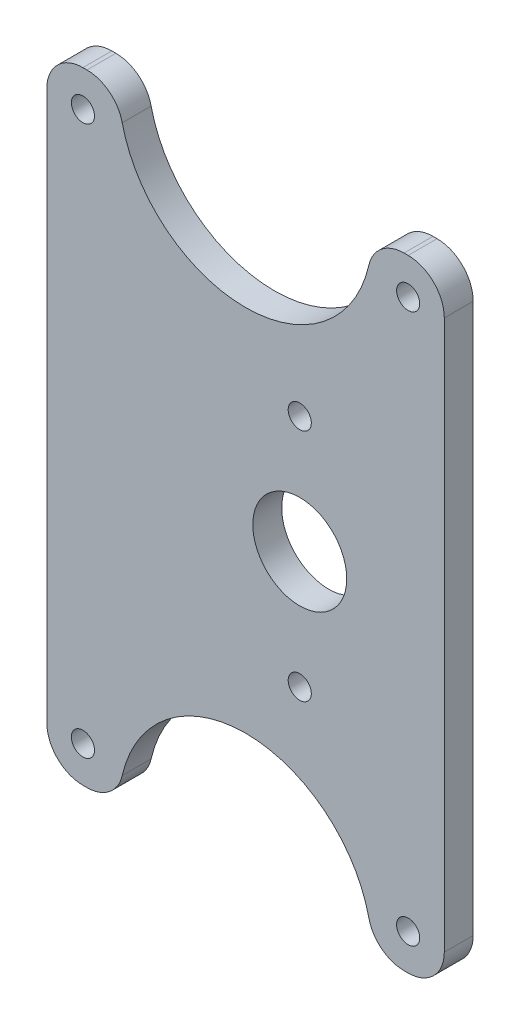
ISO-10303-21;
HEADER;
FILE_DESCRIPTION(('STEP AP214'),'2;1');
FILE_NAME('part.step','',(''),(''),'','','');
FILE_SCHEMA(('AUTOMOTIVE_DESIGN { 1 0 10303 214 1 1 1 1 }'));
ENDSEC;
DATA;
#1=APPLICATION_CONTEXT('core data for automotive mechanical design processes');
#2=APPLICATION_PROTOCOL_DEFINITION('international standard','automotive_design',2000,#1);
#3=PRODUCT_CONTEXT('',#1,'mechanical');
#4=PRODUCT('Part','Part','',(#3));
#5=PRODUCT_RELATED_PRODUCT_CATEGORY('part','',(#4));
#6=PRODUCT_DEFINITION_FORMATION('','',#4);
#7=PRODUCT_DEFINITION_CONTEXT('part definition',#1,'design');
#8=PRODUCT_DEFINITION('design','',#6,#7);
#9=PRODUCT_DEFINITION_SHAPE('','',#8);
#10=(LENGTH_UNIT() NAMED_UNIT(*) SI_UNIT(.MILLI.,.METRE.));
#11=(NAMED_UNIT(*) PLANE_ANGLE_UNIT() SI_UNIT($,.RADIAN.));
#12=(NAMED_UNIT(*) SI_UNIT($,.STERADIAN.) SOLID_ANGLE_UNIT());
#13=UNCERTAINTY_MEASURE_WITH_UNIT(LENGTH_MEASURE(1.E-05),#10,'distance_accuracy_value','');
#14=(GEOMETRIC_REPRESENTATION_CONTEXT(3) GLOBAL_UNCERTAINTY_ASSIGNED_CONTEXT((#13)) GLOBAL_UNIT_ASSIGNED_CONTEXT((#10,
#11,#12)) REPRESENTATION_CONTEXT('',''));
#15=CARTESIAN_POINT('',(0.,0.,0.));
#16=DIRECTION('',(0.,0.,1.));
#17=DIRECTION('',(1.,0.,0.));
#18=AXIS2_PLACEMENT_3D('',#15,#16,#17);
#19=CARTESIAN_POINT('',(-27.5,43.,2.));
#20=DIRECTION('',(0.,-1.,0.));
#21=DIRECTION('',(0.,0.,-1.));
#22=AXIS2_PLACEMENT_3D('',#19,#20,#21);
#23=PLANE('',#22);
#24=DIRECTION('',(-1.,0.,0.));
#25=VECTOR('',#24,1.);
#26=CARTESIAN_POINT('',(-27.5,43.,2.));
#27=LINE('',#26,#25);
#28=CARTESIAN_POINT('',(22.5,43.,2.));
#29=VERTEX_POINT('',#28);
#30=CARTESIAN_POINT('',(21.9374109684803,43.,2.));
#31=VERTEX_POINT('',#30);
#32=EDGE_CURVE('E302',#29,#31,#27,.T.);
#33=ORIENTED_EDGE('',*,*,#32,.F.);
#34=DIRECTION('',(0.,0.,-1.));
#35=VECTOR('',#34,1.);
#36=CARTESIAN_POINT('',(22.5,43.,2.));
#37=LINE('',#36,#35);
#38=CARTESIAN_POINT('',(22.5,43.,-2.));
#39=VERTEX_POINT('',#38);
#40=EDGE_CURVE('E282',#29,#39,#37,.T.);
#41=ORIENTED_EDGE('',*,*,#40,.T.);
#42=DIRECTION('',(-1.,0.,0.));
#43=VECTOR('',#42,1.);
#44=CARTESIAN_POINT('',(-27.5,43.,-2.));
#45=LINE('',#44,#43);
#46=CARTESIAN_POINT('',(21.9374109684803,43.,-2.));
#47=VERTEX_POINT('',#46);
#48=EDGE_CURVE('E185',#39,#47,#45,.T.);
#49=ORIENTED_EDGE('',*,*,#48,.T.);
#50=DIRECTION('',(0.,0.,1.));
#51=VECTOR('',#50,1.);
#52=CARTESIAN_POINT('',(21.9374109684803,43.,2.));
#53=LINE('',#52,#51);
#54=EDGE_CURVE('E279',#47,#31,#53,.T.);
#55=ORIENTED_EDGE('',*,*,#54,.T.);
#56=EDGE_LOOP('',(#33,#41,#49,#55));
#57=FACE_BOUND('',#56,.T.);
#58=ADVANCED_FACE('F39',(#57),#23,.F.);
#59=CARTESIAN_POINT('',(-27.5,-43.,2.));
#60=DIRECTION('',(0.,1.,0.));
#61=DIRECTION('',(0.,0.,1.));
#62=AXIS2_PLACEMENT_3D('',#59,#60,#61);
#63=PLANE('',#62);
#64=DIRECTION('',(1.,0.,0.));
#65=VECTOR('',#64,1.);
#66=CARTESIAN_POINT('',(-27.5,-43.,2.));
#67=LINE('',#66,#65);
#68=CARTESIAN_POINT('',(-22.5,-43.,2.));
#69=VERTEX_POINT('',#68);
#70=CARTESIAN_POINT('',(-21.9374109684803,-43.,2.));
#71=VERTEX_POINT('',#70);
#72=EDGE_CURVE('E205',#69,#71,#67,.T.);
#73=ORIENTED_EDGE('',*,*,#72,.F.);
#74=DIRECTION('',(0.,0.,-1.));
#75=VECTOR('',#74,1.);
#76=CARTESIAN_POINT('',(-22.5,-43.,2.));
#77=LINE('',#76,#75);
#78=CARTESIAN_POINT('',(-22.5,-43.,-2.));
#79=VERTEX_POINT('',#78);
#80=EDGE_CURVE('E261',#69,#79,#77,.T.);
#81=ORIENTED_EDGE('',*,*,#80,.T.);
#82=DIRECTION('',(1.,0.,0.));
#83=VECTOR('',#82,1.);
#84=CARTESIAN_POINT('',(-27.5,-43.,-2.));
#85=LINE('',#84,#83);
#86=CARTESIAN_POINT('',(-21.9374109684803,-43.,-2.));
#87=VERTEX_POINT('',#86);
#88=EDGE_CURVE('E190',#79,#87,#85,.T.);
#89=ORIENTED_EDGE('',*,*,#88,.T.);
#90=DIRECTION('',(0.,0.,1.));
#91=VECTOR('',#90,1.);
#92=CARTESIAN_POINT('',(-21.9374109684803,-43.,2.));
#93=LINE('',#92,#91);
#94=EDGE_CURVE('E257',#87,#71,#93,.T.);
#95=ORIENTED_EDGE('',*,*,#94,.T.);
#96=EDGE_LOOP('',(#73,#81,#89,#95));
#97=FACE_BOUND('',#96,.T.);
#98=ADVANCED_FACE('F402',(#97),#63,.F.);
#99=CARTESIAN_POINT('',(27.5,43.,2.));
#100=DIRECTION('',(-1.,0.,0.));
#101=DIRECTION('',(0.,-1.,0.));
#102=AXIS2_PLACEMENT_3D('',#99,#100,#101);
#103=PLANE('',#102);
#104=DIRECTION('',(0.,1.,0.));
#105=VECTOR('',#104,1.);
#106=CARTESIAN_POINT('',(27.5,43.,2.));
#107=LINE('',#106,#105);
#108=CARTESIAN_POINT('',(27.5,-38.,2.));
#109=VERTEX_POINT('',#108);
#110=CARTESIAN_POINT('',(27.5,38.,2.));
#111=VERTEX_POINT('',#110);
#112=EDGE_CURVE('E199',#109,#111,#107,.T.);
#113=ORIENTED_EDGE('',*,*,#112,.F.);
#114=DIRECTION('',(0.,0.,-1.));
#115=VECTOR('',#114,1.);
#116=CARTESIAN_POINT('',(27.5,-38.,2.));
#117=LINE('',#116,#115);
#118=CARTESIAN_POINT('',(27.5,-38.,-2.));
#119=VERTEX_POINT('',#118);
#120=EDGE_CURVE('E268',#109,#119,#117,.T.);
#121=ORIENTED_EDGE('',*,*,#120,.T.);
#122=DIRECTION('',(0.,1.,0.));
#123=VECTOR('',#122,1.);
#124=CARTESIAN_POINT('',(27.5,43.,-2.));
#125=LINE('',#124,#123);
#126=CARTESIAN_POINT('',(27.5,38.,-2.));
#127=VERTEX_POINT('',#126);
#128=EDGE_CURVE('E319',#119,#127,#125,.T.);
#129=ORIENTED_EDGE('',*,*,#128,.T.);
#130=DIRECTION('',(0.,0.,-1.));
#131=VECTOR('',#130,1.);
#132=CARTESIAN_POINT('',(27.5,38.,2.));
#133=LINE('',#132,#131);
#134=EDGE_CURVE('E265',#127,#111,#133,.F.);
#135=ORIENTED_EDGE('',*,*,#134,.T.);
#136=EDGE_LOOP('',(#113,#121,#129,#135));
#137=FACE_BOUND('',#136,.T.);
#138=ADVANCED_FACE('F428',(#137),#103,.F.);
#139=CARTESIAN_POINT('',(-21.9374109684803,43.,-2.));
#140=VERTEX_POINT('',#139);
#141=CARTESIAN_POINT('',(-22.5,43.,-2.));
#142=VERTEX_POINT('',#141);
#143=EDGE_CURVE('E193',#140,#142,#45,.T.);
#144=ORIENTED_EDGE('',*,*,#143,.T.);
#145=DIRECTION('',(0.,0.,-1.));
#146=VECTOR('',#145,1.);
#147=CARTESIAN_POINT('',(-22.5,43.,2.));
#148=LINE('',#147,#146);
#149=CARTESIAN_POINT('',(-22.5,43.,2.));
#150=VERTEX_POINT('',#149);
#151=EDGE_CURVE('E160',#142,#150,#148,.F.);
#152=ORIENTED_EDGE('',*,*,#151,.T.);
#153=CARTESIAN_POINT('',(-21.9374109684803,43.,2.));
#154=VERTEX_POINT('',#153);
#155=EDGE_CURVE('E308',#154,#150,#27,.T.);
#156=ORIENTED_EDGE('',*,*,#155,.F.);
#157=DIRECTION('',(0.,0.,1.));
#158=VECTOR('',#157,1.);
#159=CARTESIAN_POINT('',(-21.9374109684803,43.,2.));
#160=LINE('',#159,#158);
#161=EDGE_CURVE('E166',#154,#140,#160,.F.);
#162=ORIENTED_EDGE('',*,*,#161,.T.);
#163=EDGE_LOOP('',(#144,#152,#156,#162));
#164=FACE_BOUND('',#163,.T.);
#165=ADVANCED_FACE('F412',(#164),#23,.F.);
#166=CARTESIAN_POINT('',(-27.5,43.,2.));
#167=DIRECTION('',(1.,0.,0.));
#168=DIRECTION('',(0.,1.,0.));
#169=AXIS2_PLACEMENT_3D('',#166,#167,#168);
#170=PLANE('',#169);
#171=DIRECTION('',(0.,-1.,0.));
#172=VECTOR('',#171,1.);
#173=CARTESIAN_POINT('',(-27.5,43.,2.));
#174=LINE('',#173,#172);
#175=CARTESIAN_POINT('',(-27.5,38.,2.));
#176=VERTEX_POINT('',#175);
#177=CARTESIAN_POINT('',(-27.5,-38.,2.));
#178=VERTEX_POINT('',#177);
#179=EDGE_CURVE('E176',#176,#178,#174,.T.);
#180=ORIENTED_EDGE('',*,*,#179,.F.);
#181=DIRECTION('',(0.,0.,-1.));
#182=VECTOR('',#181,1.);
#183=CARTESIAN_POINT('',(-27.5,38.,2.));
#184=LINE('',#183,#182);
#185=CARTESIAN_POINT('',(-27.5,38.,-2.));
#186=VERTEX_POINT('',#185);
#187=EDGE_CURVE('E159',#176,#186,#184,.T.);
#188=ORIENTED_EDGE('',*,*,#187,.T.);
#189=DIRECTION('',(0.,-1.,0.));
#190=VECTOR('',#189,1.);
#191=CARTESIAN_POINT('',(-27.5,43.,-2.));
#192=LINE('',#191,#190);
#193=CARTESIAN_POINT('',(-27.5,-38.,-2.));
#194=VERTEX_POINT('',#193);
#195=EDGE_CURVE('E173',#186,#194,#192,.T.);
#196=ORIENTED_EDGE('',*,*,#195,.T.);
#197=DIRECTION('',(0.,0.,-1.));
#198=VECTOR('',#197,1.);
#199=CARTESIAN_POINT('',(-27.5,-38.,2.));
#200=LINE('',#199,#198);
#201=EDGE_CURVE('E179',#194,#178,#200,.F.);
#202=ORIENTED_EDGE('',*,*,#201,.T.);
#203=EDGE_LOOP('',(#180,#188,#196,#202));
#204=FACE_BOUND('',#203,.T.);
#205=ADVANCED_FACE('F172',(#204),#170,.F.);
#206=CARTESIAN_POINT('',(21.9374109684803,-43.,-2.));
#207=VERTEX_POINT('',#206);
#208=CARTESIAN_POINT('',(22.5,-43.,-2.));
#209=VERTEX_POINT('',#208);
#210=EDGE_CURVE('E184',#207,#209,#85,.T.);
#211=ORIENTED_EDGE('',*,*,#210,.T.);
#212=DIRECTION('',(0.,0.,-1.));
#213=VECTOR('',#212,1.);
#214=CARTESIAN_POINT('',(22.5,-43.,2.));
#215=LINE('',#214,#213);
#216=CARTESIAN_POINT('',(22.5,-43.,2.));
#217=VERTEX_POINT('',#216);
#218=EDGE_CURVE('E276',#209,#217,#215,.F.);
#219=ORIENTED_EDGE('',*,*,#218,.T.);
#220=CARTESIAN_POINT('',(21.9374109684803,-43.,2.));
#221=VERTEX_POINT('',#220);
#222=EDGE_CURVE('E312',#221,#217,#67,.T.);
#223=ORIENTED_EDGE('',*,*,#222,.F.);
#224=DIRECTION('',(0.,0.,1.));
#225=VECTOR('',#224,1.);
#226=CARTESIAN_POINT('',(21.9374109684803,-43.,2.));
#227=LINE('',#226,#225);
#228=EDGE_CURVE('E272',#221,#207,#227,.F.);
#229=ORIENTED_EDGE('',*,*,#228,.T.);
#230=EDGE_LOOP('',(#211,#219,#223,#229));
#231=FACE_BOUND('',#230,.T.);
#232=ADVANCED_FACE('F430',(#231),#63,.F.);
#233=CARTESIAN_POINT('',(0.,0.,2.));
#234=DIRECTION('',(0.,0.,1.));
#235=DIRECTION('',(1.,0.,0.));
#236=AXIS2_PLACEMENT_3D('',#233,#234,#235);
#237=PLANE('',#236);
#238=ORIENTED_EDGE('',*,*,#155,.T.);
#239=CARTESIAN_POINT('',(-22.5,38.,2.));
#240=DIRECTION('',(0.,0.,1.));
#241=DIRECTION('',(1.,0.,0.));
#242=AXIS2_PLACEMENT_3D('',#239,#240,#241);
#243=CIRCLE('',#242,5.);
#244=EDGE_CURVE('E254',#150,#176,#243,.T.);
#245=ORIENTED_EDGE('',*,*,#244,.T.);
#246=ORIENTED_EDGE('',*,*,#179,.T.);
#247=CARTESIAN_POINT('',(-22.5,-38.,2.));
#248=DIRECTION('',(0.,0.,1.));
#249=DIRECTION('',(1.,0.,0.));
#250=AXIS2_PLACEMENT_3D('',#247,#248,#249);
#251=CIRCLE('',#250,5.);
#252=EDGE_CURVE('E251',#178,#69,#251,.T.);
#253=ORIENTED_EDGE('',*,*,#252,.T.);
#254=ORIENTED_EDGE('',*,*,#72,.T.);
#255=CARTESIAN_POINT('',(-21.9374109684803,-38.,2.));
#256=DIRECTION('',(0.,0.,1.));
#257=DIRECTION('',(1.,0.,0.));
#258=AXIS2_PLACEMENT_3D('',#255,#256,#257);
#259=CIRCLE('',#258,5.);
#260=CARTESIAN_POINT('',(-17.0624307532625,-39.1111111111111,2.));
#261=VERTEX_POINT('',#260);
#262=EDGE_CURVE('E243',#71,#261,#259,.T.);
#263=ORIENTED_EDGE('',*,*,#262,.T.);
#264=CARTESIAN_POINT('',(0.,-43.,2.));
#265=DIRECTION('',(0.,0.,1.));
#266=DIRECTION('',(-1.,0.,0.));
#267=AXIS2_PLACEMENT_3D('',#264,#265,#266);
#268=CIRCLE('',#267,17.5);
#269=CARTESIAN_POINT('',(17.0624307532625,-39.1111111111111,2.));
#270=VERTEX_POINT('',#269);
#271=EDGE_CURVE('E384',#270,#261,#268,.T.);
#272=ORIENTED_EDGE('',*,*,#271,.F.);
#273=CARTESIAN_POINT('',(21.9374109684803,-38.,2.));
#274=DIRECTION('',(0.,0.,1.));
#275=DIRECTION('',(1.,0.,0.));
#276=AXIS2_PLACEMENT_3D('',#273,#274,#275);
#277=CIRCLE('',#276,5.);
#278=EDGE_CURVE('E240',#270,#221,#277,.T.);
#279=ORIENTED_EDGE('',*,*,#278,.T.);
#280=ORIENTED_EDGE('',*,*,#222,.T.);
#281=CARTESIAN_POINT('',(22.5,-38.,2.));
#282=DIRECTION('',(0.,0.,1.));
#283=DIRECTION('',(1.,0.,0.));
#284=AXIS2_PLACEMENT_3D('',#281,#282,#283);
#285=CIRCLE('',#284,5.);
#286=EDGE_CURVE('E248',#217,#109,#285,.T.);
#287=ORIENTED_EDGE('',*,*,#286,.T.);
#288=ORIENTED_EDGE('',*,*,#112,.T.);
#289=CARTESIAN_POINT('',(22.5,38.,2.));
#290=DIRECTION('',(0.,0.,1.));
#291=DIRECTION('',(1.,0.,0.));
#292=AXIS2_PLACEMENT_3D('',#289,#290,#291);
#293=CIRCLE('',#292,5.);
#294=EDGE_CURVE('E63',#111,#29,#293,.T.);
#295=ORIENTED_EDGE('',*,*,#294,.T.);
#296=ORIENTED_EDGE('',*,*,#32,.T.);
#297=CARTESIAN_POINT('',(21.9374109684803,38.,2.));
#298=DIRECTION('',(0.,0.,1.));
#299=DIRECTION('',(1.,0.,0.));
#300=AXIS2_PLACEMENT_3D('',#297,#298,#299);
#301=CIRCLE('',#300,5.);
#302=CARTESIAN_POINT('',(17.0624307532625,39.1111111111111,2.));
#303=VERTEX_POINT('',#302);
#304=EDGE_CURVE('E55',#31,#303,#301,.T.);
#305=ORIENTED_EDGE('',*,*,#304,.T.);
#306=CARTESIAN_POINT('',(0.,43.,2.));
#307=DIRECTION('',(0.,0.,1.));
#308=DIRECTION('',(1.,0.,0.));
#309=AXIS2_PLACEMENT_3D('',#306,#307,#308);
#310=CIRCLE('',#309,17.5);
#311=CARTESIAN_POINT('',(-17.0624307532625,39.1111111111111,2.));
#312=VERTEX_POINT('',#311);
#313=EDGE_CURVE('E298',#312,#303,#310,.T.);
#314=ORIENTED_EDGE('',*,*,#313,.F.);
#315=CARTESIAN_POINT('',(-21.9374109684803,38.,2.));
#316=DIRECTION('',(0.,0.,1.));
#317=DIRECTION('',(1.,0.,0.));
#318=AXIS2_PLACEMENT_3D('',#315,#316,#317);
#319=CIRCLE('',#318,5.);
#320=EDGE_CURVE('E237',#312,#154,#319,.T.);
#321=ORIENTED_EDGE('',*,*,#320,.T.);
#322=EDGE_LOOP('',(#238,#245,#246,#253,#254,#263,#272,#279,#280,#287,#288,#295,#296,#305,#314,#321));
#323=FACE_BOUND('',#322,.T.);
#324=CARTESIAN_POINT('',(7.50000000000466,16.2150000000004,2.));
#325=DIRECTION('',(0.,0.,-1.));
#326=DIRECTION('',(-1.,0.,0.));
#327=AXIS2_PLACEMENT_3D('',#324,#325,#326);
#328=CIRCLE('',#327,1.59999999999998);
#329=CARTESIAN_POINT('',(5.90000000000468,16.2150000000004,2.));
#330=VERTEX_POINT('',#329);
#331=EDGE_CURVE('E350',#330,#330,#328,.T.);
#332=ORIENTED_EDGE('',*,*,#331,.T.);
#333=EDGE_LOOP('',(#332));
#334=FACE_BOUND('',#333,.T.);
#335=CARTESIAN_POINT('',(7.49999999999547,-16.2149999999996,2.));
#336=DIRECTION('',(0.,0.,-1.));
#337=DIRECTION('',(-1.,0.,0.));
#338=AXIS2_PLACEMENT_3D('',#335,#336,#337);
#339=CIRCLE('',#338,1.59999999999998);
#340=CARTESIAN_POINT('',(5.89999999999549,-16.2149999999996,2.));
#341=VERTEX_POINT('',#340);
#342=EDGE_CURVE('E373',#341,#341,#339,.T.);
#343=ORIENTED_EDGE('',*,*,#342,.T.);
#344=EDGE_LOOP('',(#343));
#345=FACE_BOUND('',#344,.T.);
#346=CARTESIAN_POINT('',(-22.5,-38.,2.));
#347=DIRECTION('',(0.,0.,1.));
#348=DIRECTION('',(-1.,0.,0.));
#349=AXIS2_PLACEMENT_3D('',#346,#347,#348);
#350=CIRCLE('',#349,1.6);
#351=CARTESIAN_POINT('',(-24.1,-38.,2.));
#352=VERTEX_POINT('',#351);
#353=EDGE_CURVE('E345',#352,#352,#350,.T.);
#354=ORIENTED_EDGE('',*,*,#353,.F.);
#355=EDGE_LOOP('',(#354));
#356=FACE_BOUND('',#355,.T.);
#357=CARTESIAN_POINT('',(22.5,-38.,2.));
#358=DIRECTION('',(0.,0.,1.));
#359=DIRECTION('',(1.,0.,0.));
#360=AXIS2_PLACEMENT_3D('',#357,#358,#359);
#361=CIRCLE('',#360,1.6);
#362=CARTESIAN_POINT('',(24.1,-38.,2.));
#363=VERTEX_POINT('',#362);
#364=EDGE_CURVE('E354',#363,#363,#361,.T.);
#365=ORIENTED_EDGE('',*,*,#364,.F.);
#366=EDGE_LOOP('',(#365));
#367=FACE_BOUND('',#366,.T.);
#368=CARTESIAN_POINT('',(22.5,38.,2.));
#369=DIRECTION('',(0.,0.,1.));
#370=DIRECTION('',(-1.,0.,0.));
#371=AXIS2_PLACEMENT_3D('',#368,#369,#370);
#372=CIRCLE('',#371,1.6);
#373=CARTESIAN_POINT('',(20.9,38.,2.));
#374=VERTEX_POINT('',#373);
#375=EDGE_CURVE('E362',#374,#374,#372,.T.);
#376=ORIENTED_EDGE('',*,*,#375,.F.);
#377=EDGE_LOOP('',(#376));
#378=FACE_BOUND('',#377,.T.);
#379=CARTESIAN_POINT('',(-22.5,38.,2.));
#380=DIRECTION('',(0.,0.,1.));
#381=DIRECTION('',(1.,0.,0.));
#382=AXIS2_PLACEMENT_3D('',#379,#380,#381);
#383=CIRCLE('',#382,1.6);
#384=CARTESIAN_POINT('',(-20.9,38.,2.));
#385=VERTEX_POINT('',#384);
#386=EDGE_CURVE('E337',#385,#385,#383,.T.);
#387=ORIENTED_EDGE('',*,*,#386,.F.);
#388=EDGE_LOOP('',(#387));
#389=FACE_BOUND('',#388,.T.);
#390=CARTESIAN_POINT('',(7.50000000000001,0.,2.));
#391=DIRECTION('',(0.,0.,1.));
#392=DIRECTION('',(1.,0.,0.));
#393=AXIS2_PLACEMENT_3D('',#390,#391,#392);
#394=CIRCLE('',#393,6.5);
#395=CARTESIAN_POINT('',(14.,0.,2.));
#396=VERTEX_POINT('',#395);
#397=EDGE_CURVE('E329',#396,#396,#394,.T.);
#398=ORIENTED_EDGE('',*,*,#397,.F.);
#399=EDGE_LOOP('',(#398));
#400=FACE_BOUND('',#399,.T.);
#401=ADVANCED_FACE('F305',(#323,#334,#345,#356,#367,#378,#389,#400),#237,.T.);
#402=CARTESIAN_POINT('',(0.,0.,-2.));
#403=DIRECTION('',(0.,0.,1.));
#404=DIRECTION('',(1.,0.,0.));
#405=AXIS2_PLACEMENT_3D('',#402,#403,#404);
#406=PLANE('',#405);
#407=CARTESIAN_POINT('',(7.50000000000466,16.2150000000004,-2.));
#408=DIRECTION('',(0.,0.,-1.));
#409=DIRECTION('',(-1.,0.,0.));
#410=AXIS2_PLACEMENT_3D('',#407,#408,#409);
#411=CIRCLE('',#410,1.59999999999998);
#412=CARTESIAN_POINT('',(5.90000000000468,16.2150000000004,-2.));
#413=VERTEX_POINT('',#412);
#414=EDGE_CURVE('E377',#413,#413,#411,.T.);
#415=ORIENTED_EDGE('',*,*,#414,.F.);
#416=EDGE_LOOP('',(#415));
#417=FACE_BOUND('',#416,.T.);
#418=CARTESIAN_POINT('',(7.49999999999547,-16.2149999999996,-2.));
#419=DIRECTION('',(0.,0.,-1.));
#420=DIRECTION('',(-1.,0.,0.));
#421=AXIS2_PLACEMENT_3D('',#418,#419,#420);
#422=CIRCLE('',#421,1.59999999999998);
#423=CARTESIAN_POINT('',(5.89999999999549,-16.2149999999996,-2.));
#424=VERTEX_POINT('',#423);
#425=EDGE_CURVE('E369',#424,#424,#422,.T.);
#426=ORIENTED_EDGE('',*,*,#425,.F.);
#427=EDGE_LOOP('',(#426));
#428=FACE_BOUND('',#427,.T.);
#429=CARTESIAN_POINT('',(-22.5,-38.,-2.));
#430=DIRECTION('',(0.,0.,1.));
#431=DIRECTION('',(-1.,0.,0.));
#432=AXIS2_PLACEMENT_3D('',#429,#430,#431);
#433=CIRCLE('',#432,1.6);
#434=CARTESIAN_POINT('',(-24.1,-38.,-2.));
#435=VERTEX_POINT('',#434);
#436=EDGE_CURVE('E349',#435,#435,#433,.T.);
#437=ORIENTED_EDGE('',*,*,#436,.T.);
#438=EDGE_LOOP('',(#437));
#439=FACE_BOUND('',#438,.T.);
#440=CARTESIAN_POINT('',(22.5,-38.,-2.));
#441=DIRECTION('',(0.,0.,1.));
#442=DIRECTION('',(1.,0.,0.));
#443=AXIS2_PLACEMENT_3D('',#440,#441,#442);
#444=CIRCLE('',#443,1.6);
#445=CARTESIAN_POINT('',(24.1,-38.,-2.));
#446=VERTEX_POINT('',#445);
#447=EDGE_CURVE('E358',#446,#446,#444,.T.);
#448=ORIENTED_EDGE('',*,*,#447,.T.);
#449=EDGE_LOOP('',(#448));
#450=FACE_BOUND('',#449,.T.);
#451=CARTESIAN_POINT('',(22.5,38.,-2.));
#452=DIRECTION('',(0.,0.,1.));
#453=DIRECTION('',(-1.,0.,0.));
#454=AXIS2_PLACEMENT_3D('',#451,#452,#453);
#455=CIRCLE('',#454,1.6);
#456=CARTESIAN_POINT('',(20.9,38.,-2.));
#457=VERTEX_POINT('',#456);
#458=EDGE_CURVE('E341',#457,#457,#455,.T.);
#459=ORIENTED_EDGE('',*,*,#458,.T.);
#460=EDGE_LOOP('',(#459));
#461=FACE_BOUND('',#460,.T.);
#462=CARTESIAN_POINT('',(-22.5,38.,-2.));
#463=DIRECTION('',(0.,0.,1.));
#464=DIRECTION('',(1.,0.,0.));
#465=AXIS2_PLACEMENT_3D('',#462,#463,#464);
#466=CIRCLE('',#465,1.6);
#467=CARTESIAN_POINT('',(-20.9,38.,-2.));
#468=VERTEX_POINT('',#467);
#469=EDGE_CURVE('E335',#468,#468,#466,.T.);
#470=ORIENTED_EDGE('',*,*,#469,.T.);
#471=EDGE_LOOP('',(#470));
#472=FACE_BOUND('',#471,.T.);
#473=CARTESIAN_POINT('',(7.50000000000001,0.,-2.));
#474=DIRECTION('',(0.,0.,1.));
#475=DIRECTION('',(1.,0.,0.));
#476=AXIS2_PLACEMENT_3D('',#473,#474,#475);
#477=CIRCLE('',#476,6.5);
#478=CARTESIAN_POINT('',(14.,0.,-2.));
#479=VERTEX_POINT('',#478);
#480=EDGE_CURVE('E322',#479,#479,#477,.T.);
#481=ORIENTED_EDGE('',*,*,#480,.T.);
#482=EDGE_LOOP('',(#481));
#483=FACE_BOUND('',#482,.T.);
#484=ORIENTED_EDGE('',*,*,#195,.F.);
#485=CARTESIAN_POINT('',(-22.5,38.,-2.));
#486=DIRECTION('',(0.,0.,1.));
#487=DIRECTION('',(1.,0.,0.));
#488=AXIS2_PLACEMENT_3D('',#485,#486,#487);
#489=CIRCLE('',#488,5.);
#490=EDGE_CURVE('E155',#186,#142,#489,.F.);
#491=ORIENTED_EDGE('',*,*,#490,.T.);
#492=ORIENTED_EDGE('',*,*,#143,.F.);
#493=CARTESIAN_POINT('',(-21.9374109684803,38.,-2.));
#494=DIRECTION('',(0.,0.,1.));
#495=DIRECTION('',(1.,0.,0.));
#496=AXIS2_PLACEMENT_3D('',#493,#494,#495);
#497=CIRCLE('',#496,5.);
#498=CARTESIAN_POINT('',(-17.0624307532625,39.1111111111111,-2.));
#499=VERTEX_POINT('',#498);
#500=EDGE_CURVE('E213',#140,#499,#497,.F.);
#501=ORIENTED_EDGE('',*,*,#500,.T.);
#502=CARTESIAN_POINT('',(0.,43.,-2.));
#503=DIRECTION('',(0.,0.,1.));
#504=DIRECTION('',(1.,0.,0.));
#505=AXIS2_PLACEMENT_3D('',#502,#503,#504);
#506=CIRCLE('',#505,17.5);
#507=CARTESIAN_POINT('',(17.0624307532625,39.1111111111111,-2.));
#508=VERTEX_POINT('',#507);
#509=EDGE_CURVE('E204',#499,#508,#506,.T.);
#510=ORIENTED_EDGE('',*,*,#509,.T.);
#511=CARTESIAN_POINT('',(21.9374109684803,38.,-2.));
#512=DIRECTION('',(0.,0.,1.));
#513=DIRECTION('',(1.,0.,0.));
#514=AXIS2_PLACEMENT_3D('',#511,#512,#513);
#515=CIRCLE('',#514,5.);
#516=EDGE_CURVE('E178',#508,#47,#515,.F.);
#517=ORIENTED_EDGE('',*,*,#516,.T.);
#518=ORIENTED_EDGE('',*,*,#48,.F.);
#519=CARTESIAN_POINT('',(22.5,38.,-2.));
#520=DIRECTION('',(0.,0.,1.));
#521=DIRECTION('',(1.,0.,0.));
#522=AXIS2_PLACEMENT_3D('',#519,#520,#521);
#523=CIRCLE('',#522,5.);
#524=EDGE_CURVE('E222',#39,#127,#523,.F.);
#525=ORIENTED_EDGE('',*,*,#524,.T.);
#526=ORIENTED_EDGE('',*,*,#128,.F.);
#527=CARTESIAN_POINT('',(22.5,-38.,-2.));
#528=DIRECTION('',(0.,0.,1.));
#529=DIRECTION('',(1.,0.,0.));
#530=AXIS2_PLACEMENT_3D('',#527,#528,#529);
#531=CIRCLE('',#530,5.);
#532=EDGE_CURVE('E225',#119,#209,#531,.F.);
#533=ORIENTED_EDGE('',*,*,#532,.T.);
#534=ORIENTED_EDGE('',*,*,#210,.F.);
#535=CARTESIAN_POINT('',(21.9374109684803,-38.,-2.));
#536=DIRECTION('',(0.,0.,1.));
#537=DIRECTION('',(1.,0.,0.));
#538=AXIS2_PLACEMENT_3D('',#535,#536,#537);
#539=CIRCLE('',#538,5.);
#540=CARTESIAN_POINT('',(17.0624307532625,-39.1111111111111,-2.));
#541=VERTEX_POINT('',#540);
#542=EDGE_CURVE('E216',#207,#541,#539,.F.);
#543=ORIENTED_EDGE('',*,*,#542,.T.);
#544=CARTESIAN_POINT('',(0.,-43.,-2.));
#545=DIRECTION('',(0.,0.,1.));
#546=DIRECTION('',(1.,0.,0.));
#547=AXIS2_PLACEMENT_3D('',#544,#545,#546);
#548=CIRCLE('',#547,17.5);
#549=CARTESIAN_POINT('',(-17.0624307532625,-39.1111111111111,-2.));
#550=VERTEX_POINT('',#549);
#551=EDGE_CURVE('E200',#541,#550,#548,.T.);
#552=ORIENTED_EDGE('',*,*,#551,.T.);
#553=CARTESIAN_POINT('',(-21.9374109684803,-38.,-2.));
#554=DIRECTION('',(0.,0.,1.));
#555=DIRECTION('',(1.,0.,0.));
#556=AXIS2_PLACEMENT_3D('',#553,#554,#555);
#557=CIRCLE('',#556,5.);
#558=EDGE_CURVE('E219',#550,#87,#557,.F.);
#559=ORIENTED_EDGE('',*,*,#558,.T.);
#560=ORIENTED_EDGE('',*,*,#88,.F.);
#561=CARTESIAN_POINT('',(-22.5,-38.,-2.));
#562=DIRECTION('',(0.,0.,1.));
#563=DIRECTION('',(1.,0.,0.));
#564=AXIS2_PLACEMENT_3D('',#561,#562,#563);
#565=CIRCLE('',#564,5.);
#566=EDGE_CURVE('E167',#79,#194,#565,.F.);
#567=ORIENTED_EDGE('',*,*,#566,.T.);
#568=EDGE_LOOP('',(#484,#491,#492,#501,#510,#517,#518,#525,#526,#533,#534,#543,#552,#559,#560,#567));
#569=FACE_BOUND('',#568,.T.);
#570=ADVANCED_FACE('F181',(#417,#428,#439,#450,#461,#472,#483,#569),#406,.F.);
#571=CARTESIAN_POINT('',(7.50000000000001,0.,-2.));
#572=DIRECTION('',(0.,0.,1.));
#573=DIRECTION('',(1.,0.,0.));
#574=AXIS2_PLACEMENT_3D('',#571,#572,#573);
#575=CYLINDRICAL_SURFACE('',#574,6.5);
#576=ORIENTED_EDGE('',*,*,#480,.F.);
#577=EDGE_LOOP('',(#576));
#578=FACE_BOUND('',#577,.T.);
#579=ORIENTED_EDGE('',*,*,#397,.T.);
#580=EDGE_LOOP('',(#579));
#581=FACE_BOUND('',#580,.T.);
#582=ADVANCED_FACE('F574',(#578,#581),#575,.F.);
#583=CARTESIAN_POINT('',(-22.5,38.,-2.));
#584=DIRECTION('',(0.,0.,1.));
#585=DIRECTION('',(1.,0.,0.));
#586=AXIS2_PLACEMENT_3D('',#583,#584,#585);
#587=CYLINDRICAL_SURFACE('',#586,1.6);
#588=ORIENTED_EDGE('',*,*,#469,.F.);
#589=EDGE_LOOP('',(#588));
#590=FACE_BOUND('',#589,.T.);
#591=ORIENTED_EDGE('',*,*,#386,.T.);
#592=EDGE_LOOP('',(#591));
#593=FACE_BOUND('',#592,.T.);
#594=ADVANCED_FACE('F565',(#590,#593),#587,.F.);
#595=CARTESIAN_POINT('',(22.5,38.,-2.));
#596=DIRECTION('',(0.,0.,1.));
#597=DIRECTION('',(1.,0.,0.));
#598=AXIS2_PLACEMENT_3D('',#595,#596,#597);
#599=CYLINDRICAL_SURFACE('',#598,1.6);
#600=ORIENTED_EDGE('',*,*,#458,.F.);
#601=EDGE_LOOP('',(#600));
#602=FACE_BOUND('',#601,.T.);
#603=ORIENTED_EDGE('',*,*,#375,.T.);
#604=EDGE_LOOP('',(#603));
#605=FACE_BOUND('',#604,.T.);
#606=ADVANCED_FACE('F556',(#602,#605),#599,.F.);
#607=CARTESIAN_POINT('',(22.5,-38.,-2.));
#608=DIRECTION('',(0.,0.,1.));
#609=DIRECTION('',(1.,0.,0.));
#610=AXIS2_PLACEMENT_3D('',#607,#608,#609);
#611=CYLINDRICAL_SURFACE('',#610,1.6);
#612=ORIENTED_EDGE('',*,*,#447,.F.);
#613=EDGE_LOOP('',(#612));
#614=FACE_BOUND('',#613,.T.);
#615=ORIENTED_EDGE('',*,*,#364,.T.);
#616=EDGE_LOOP('',(#615));
#617=FACE_BOUND('',#616,.T.);
#618=ADVANCED_FACE('F547',(#614,#617),#611,.F.);
#619=CARTESIAN_POINT('',(-22.5,-38.,-2.));
#620=DIRECTION('',(0.,0.,1.));
#621=DIRECTION('',(1.,0.,0.));
#622=AXIS2_PLACEMENT_3D('',#619,#620,#621);
#623=CYLINDRICAL_SURFACE('',#622,1.6);
#624=ORIENTED_EDGE('',*,*,#436,.F.);
#625=EDGE_LOOP('',(#624));
#626=FACE_BOUND('',#625,.T.);
#627=ORIENTED_EDGE('',*,*,#353,.T.);
#628=EDGE_LOOP('',(#627));
#629=FACE_BOUND('',#628,.T.);
#630=ADVANCED_FACE('F538',(#626,#629),#623,.F.);
#631=CARTESIAN_POINT('',(7.49999999999547,-16.2149999999996,2.));
#632=DIRECTION('',(0.,0.,-1.));
#633=DIRECTION('',(-1.,0.,0.));
#634=AXIS2_PLACEMENT_3D('',#631,#632,#633);
#635=CYLINDRICAL_SURFACE('',#634,1.59999999999998);
#636=ORIENTED_EDGE('',*,*,#342,.F.);
#637=EDGE_LOOP('',(#636));
#638=FACE_BOUND('',#637,.T.);
#639=ORIENTED_EDGE('',*,*,#425,.T.);
#640=EDGE_LOOP('',(#639));
#641=FACE_BOUND('',#640,.T.);
#642=ADVANCED_FACE('F529',(#638,#641),#635,.F.);
#643=CARTESIAN_POINT('',(7.50000000000466,16.2150000000004,2.));
#644=DIRECTION('',(0.,0.,-1.));
#645=DIRECTION('',(-1.,0.,0.));
#646=AXIS2_PLACEMENT_3D('',#643,#644,#645);
#647=CYLINDRICAL_SURFACE('',#646,1.59999999999998);
#648=ORIENTED_EDGE('',*,*,#331,.F.);
#649=EDGE_LOOP('',(#648));
#650=FACE_BOUND('',#649,.T.);
#651=ORIENTED_EDGE('',*,*,#414,.T.);
#652=EDGE_LOOP('',(#651));
#653=FACE_BOUND('',#652,.T.);
#654=ADVANCED_FACE('F511',(#650,#653),#647,.F.);
#655=CARTESIAN_POINT('',(0.,-43.,-2.));
#656=DIRECTION('',(0.,0.,1.));
#657=DIRECTION('',(1.,0.,0.));
#658=AXIS2_PLACEMENT_3D('',#655,#656,#657);
#659=CYLINDRICAL_SURFACE('',#658,17.5);
#660=ORIENTED_EDGE('',*,*,#271,.T.);
#661=DIRECTION('',(0.,0.,1.));
#662=VECTOR('',#661,1.);
#663=CARTESIAN_POINT('',(-17.0624307532625,-39.1111111111111,-2.));
#664=LINE('',#663,#662);
#665=EDGE_CURVE('E289',#261,#550,#664,.F.);
#666=ORIENTED_EDGE('',*,*,#665,.T.);
#667=ORIENTED_EDGE('',*,*,#551,.F.);
#668=DIRECTION('',(0.,0.,1.));
#669=VECTOR('',#668,1.);
#670=CARTESIAN_POINT('',(17.0624307532625,-39.1111111111111,-2.));
#671=LINE('',#670,#669);
#672=EDGE_CURVE('E286',#541,#270,#671,.T.);
#673=ORIENTED_EDGE('',*,*,#672,.T.);
#674=EDGE_LOOP('',(#660,#666,#667,#673));
#675=FACE_BOUND('',#674,.T.);
#676=ADVANCED_FACE('F392',(#675),#659,.F.);
#677=CARTESIAN_POINT('',(0.,43.,-2.));
#678=DIRECTION('',(0.,0.,1.));
#679=DIRECTION('',(1.,0.,0.));
#680=AXIS2_PLACEMENT_3D('',#677,#678,#679);
#681=CYLINDRICAL_SURFACE('',#680,17.5);
#682=ORIENTED_EDGE('',*,*,#509,.F.);
#683=DIRECTION('',(0.,0.,1.));
#684=VECTOR('',#683,1.);
#685=CARTESIAN_POINT('',(-17.0624307532625,39.1111111111111,-2.));
#686=LINE('',#685,#684);
#687=EDGE_CURVE('E11',#499,#312,#686,.T.);
#688=ORIENTED_EDGE('',*,*,#687,.T.);
#689=ORIENTED_EDGE('',*,*,#313,.T.);
#690=DIRECTION('',(0.,0.,1.));
#691=VECTOR('',#690,1.);
#692=CARTESIAN_POINT('',(17.0624307532625,39.1111111111111,-2.));
#693=LINE('',#692,#691);
#694=EDGE_CURVE('E48',#303,#508,#693,.F.);
#695=ORIENTED_EDGE('',*,*,#694,.T.);
#696=EDGE_LOOP('',(#682,#688,#689,#695));
#697=FACE_BOUND('',#696,.T.);
#698=ADVANCED_FACE('F295',(#697),#681,.F.);
#699=CARTESIAN_POINT('',(-22.5,38.,2.));
#700=DIRECTION('',(0.,0.,-1.));
#701=DIRECTION('',(-1.,0.,0.));
#702=AXIS2_PLACEMENT_3D('',#699,#700,#701);
#703=CYLINDRICAL_SURFACE('',#702,5.);
#704=ORIENTED_EDGE('',*,*,#244,.F.);
#705=ORIENTED_EDGE('',*,*,#151,.F.);
#706=ORIENTED_EDGE('',*,*,#490,.F.);
#707=ORIENTED_EDGE('',*,*,#187,.F.);
#708=EDGE_LOOP('',(#704,#705,#706,#707));
#709=FACE_BOUND('',#708,.T.);
#710=ADVANCED_FACE('F158',(#709),#703,.T.);
#711=CARTESIAN_POINT('',(-22.5,-38.,2.));
#712=DIRECTION('',(0.,0.,-1.));
#713=DIRECTION('',(-1.,0.,0.));
#714=AXIS2_PLACEMENT_3D('',#711,#712,#713);
#715=CYLINDRICAL_SURFACE('',#714,5.);
#716=ORIENTED_EDGE('',*,*,#252,.F.);
#717=ORIENTED_EDGE('',*,*,#201,.F.);
#718=ORIENTED_EDGE('',*,*,#566,.F.);
#719=ORIENTED_EDGE('',*,*,#80,.F.);
#720=EDGE_LOOP('',(#716,#717,#718,#719));
#721=FACE_BOUND('',#720,.T.);
#722=ADVANCED_FACE('F407',(#721),#715,.T.);
#723=CARTESIAN_POINT('',(22.5,-38.,2.));
#724=DIRECTION('',(0.,0.,-1.));
#725=DIRECTION('',(-1.,0.,0.));
#726=AXIS2_PLACEMENT_3D('',#723,#724,#725);
#727=CYLINDRICAL_SURFACE('',#726,5.);
#728=ORIENTED_EDGE('',*,*,#286,.F.);
#729=ORIENTED_EDGE('',*,*,#218,.F.);
#730=ORIENTED_EDGE('',*,*,#532,.F.);
#731=ORIENTED_EDGE('',*,*,#120,.F.);
#732=EDGE_LOOP('',(#728,#729,#730,#731));
#733=FACE_BOUND('',#732,.T.);
#734=ADVANCED_FACE('F446',(#733),#727,.T.);
#735=CARTESIAN_POINT('',(22.5,38.,2.));
#736=DIRECTION('',(0.,0.,-1.));
#737=DIRECTION('',(-1.,0.,0.));
#738=AXIS2_PLACEMENT_3D('',#735,#736,#737);
#739=CYLINDRICAL_SURFACE('',#738,5.);
#740=ORIENTED_EDGE('',*,*,#294,.F.);
#741=ORIENTED_EDGE('',*,*,#134,.F.);
#742=ORIENTED_EDGE('',*,*,#524,.F.);
#743=ORIENTED_EDGE('',*,*,#40,.F.);
#744=EDGE_LOOP('',(#740,#741,#742,#743));
#745=FACE_BOUND('',#744,.T.);
#746=ADVANCED_FACE('F449',(#745),#739,.T.);
#747=CARTESIAN_POINT('',(-21.9374109684803,-38.,-2.));
#748=DIRECTION('',(0.,0.,1.));
#749=DIRECTION('',(1.,0.,0.));
#750=AXIS2_PLACEMENT_3D('',#747,#748,#749);
#751=CYLINDRICAL_SURFACE('',#750,5.);
#752=ORIENTED_EDGE('',*,*,#558,.F.);
#753=ORIENTED_EDGE('',*,*,#665,.F.);
#754=ORIENTED_EDGE('',*,*,#262,.F.);
#755=ORIENTED_EDGE('',*,*,#94,.F.);
#756=EDGE_LOOP('',(#752,#753,#754,#755));
#757=FACE_BOUND('',#756,.T.);
#758=ADVANCED_FACE('F398',(#757),#751,.T.);
#759=CARTESIAN_POINT('',(21.9374109684803,-38.,-2.));
#760=DIRECTION('',(0.,0.,1.));
#761=DIRECTION('',(1.,0.,0.));
#762=AXIS2_PLACEMENT_3D('',#759,#760,#761);
#763=CYLINDRICAL_SURFACE('',#762,5.);
#764=ORIENTED_EDGE('',*,*,#278,.F.);
#765=ORIENTED_EDGE('',*,*,#672,.F.);
#766=ORIENTED_EDGE('',*,*,#542,.F.);
#767=ORIENTED_EDGE('',*,*,#228,.F.);
#768=EDGE_LOOP('',(#764,#765,#766,#767));
#769=FACE_BOUND('',#768,.T.);
#770=ADVANCED_FACE('F416',(#769),#763,.T.);
#771=CARTESIAN_POINT('',(-21.9374109684803,38.,-2.));
#772=DIRECTION('',(0.,0.,1.));
#773=DIRECTION('',(1.,0.,0.));
#774=AXIS2_PLACEMENT_3D('',#771,#772,#773);
#775=CYLINDRICAL_SURFACE('',#774,5.);
#776=ORIENTED_EDGE('',*,*,#320,.F.);
#777=ORIENTED_EDGE('',*,*,#687,.F.);
#778=ORIENTED_EDGE('',*,*,#500,.F.);
#779=ORIENTED_EDGE('',*,*,#161,.F.);
#780=EDGE_LOOP('',(#776,#777,#778,#779));
#781=FACE_BOUND('',#780,.T.);
#782=ADVANCED_FACE('F414',(#781),#775,.T.);
#783=CARTESIAN_POINT('',(21.9374109684803,38.,-2.));
#784=DIRECTION('',(0.,0.,1.));
#785=DIRECTION('',(1.,0.,0.));
#786=AXIS2_PLACEMENT_3D('',#783,#784,#785);
#787=CYLINDRICAL_SURFACE('',#786,5.);
#788=ORIENTED_EDGE('',*,*,#516,.F.);
#789=ORIENTED_EDGE('',*,*,#694,.F.);
#790=ORIENTED_EDGE('',*,*,#304,.F.);
#791=ORIENTED_EDGE('',*,*,#54,.F.);
#792=EDGE_LOOP('',(#788,#789,#790,#791));
#793=FACE_BOUND('',#792,.T.);
#794=ADVANCED_FACE('F41',(#793),#787,.T.);
#795=CLOSED_SHELL('',(#58,#98,#138,#165,#205,#232,#401,#570,#582,#594,#606,#618,#630,#642,#654,
#676,#698,#710,#722,#734,#746,#758,#770,#782,#794));
#796=MANIFOLD_SOLID_BREP('B2',#795);
#797=ADVANCED_BREP_SHAPE_REPRESENTATION('',(#18,#796),#14);
#798=SHAPE_DEFINITION_REPRESENTATION(#9,#797);
ENDSEC;
END-ISO-10303-21;
